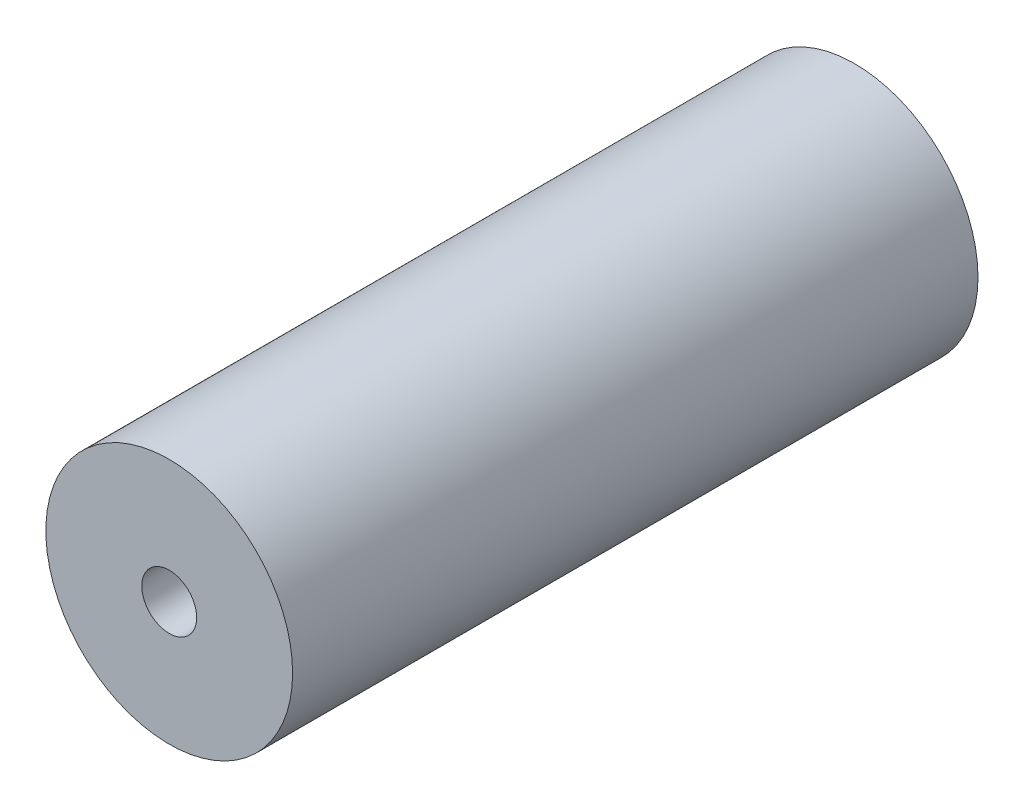
ISO-10303-21;
HEADER;
FILE_DESCRIPTION(('STEP AP214'),'2;1');
FILE_NAME('part.step','',(''),(''),'','','');
FILE_SCHEMA(('AUTOMOTIVE_DESIGN { 1 0 10303 214 1 1 1 1 }'));
ENDSEC;
DATA;
#1=APPLICATION_CONTEXT('core data for automotive mechanical design processes');
#2=APPLICATION_PROTOCOL_DEFINITION('international standard','automotive_design',2000,#1);
#3=PRODUCT_CONTEXT('',#1,'mechanical');
#4=PRODUCT('Part','Part','',(#3));
#5=PRODUCT_RELATED_PRODUCT_CATEGORY('part','',(#4));
#6=PRODUCT_DEFINITION_FORMATION('','',#4);
#7=PRODUCT_DEFINITION_CONTEXT('part definition',#1,'design');
#8=PRODUCT_DEFINITION('design','',#6,#7);
#9=PRODUCT_DEFINITION_SHAPE('','',#8);
#10=(LENGTH_UNIT() NAMED_UNIT(*) SI_UNIT(.MILLI.,.METRE.));
#11=(NAMED_UNIT(*) PLANE_ANGLE_UNIT() SI_UNIT($,.RADIAN.));
#12=(NAMED_UNIT(*) SI_UNIT($,.STERADIAN.) SOLID_ANGLE_UNIT());
#13=UNCERTAINTY_MEASURE_WITH_UNIT(LENGTH_MEASURE(1.E-05),#10,'distance_accuracy_value','');
#14=(GEOMETRIC_REPRESENTATION_CONTEXT(3) GLOBAL_UNCERTAINTY_ASSIGNED_CONTEXT((#13)) GLOBAL_UNIT_ASSIGNED_CONTEXT((#10,
#11,#12)) REPRESENTATION_CONTEXT('',''));
#15=CARTESIAN_POINT('',(0.,0.,0.));
#16=DIRECTION('',(0.,0.,1.));
#17=DIRECTION('',(1.,0.,0.));
#18=AXIS2_PLACEMENT_3D('',#15,#16,#17);
#19=CARTESIAN_POINT('',(0.,0.,-50.));
#20=DIRECTION('',(0.,0.,1.));
#21=DIRECTION('',(1.,0.,0.));
#22=AXIS2_PLACEMENT_3D('',#19,#20,#21);
#23=CYLINDRICAL_SURFACE('',#22,18.);
#24=CARTESIAN_POINT('',(0.,0.,-50.));
#25=DIRECTION('',(0.,0.,1.));
#26=DIRECTION('',(1.,0.,0.));
#27=AXIS2_PLACEMENT_3D('',#24,#25,#26);
#28=CIRCLE('',#27,18.);
#29=CARTESIAN_POINT('',(18.,0.,-50.));
#30=VERTEX_POINT('',#29);
#31=EDGE_CURVE('E10',#30,#30,#28,.T.);
#32=ORIENTED_EDGE('',*,*,#31,.T.);
#33=EDGE_LOOP('',(#32));
#34=FACE_BOUND('',#33,.T.);
#35=CARTESIAN_POINT('',(0.,0.,50.));
#36=DIRECTION('',(0.,0.,1.));
#37=DIRECTION('',(1.,0.,0.));
#38=AXIS2_PLACEMENT_3D('',#35,#36,#37);
#39=CIRCLE('',#38,18.);
#40=CARTESIAN_POINT('',(18.,0.,50.));
#41=VERTEX_POINT('',#40);
#42=EDGE_CURVE('E36',#41,#41,#39,.T.);
#43=ORIENTED_EDGE('',*,*,#42,.F.);
#44=EDGE_LOOP('',(#43));
#45=FACE_BOUND('',#44,.T.);
#46=ADVANCED_FACE('F30',(#34,#45),#23,.T.);
#47=CARTESIAN_POINT('',(0.,0.,-50.));
#48=DIRECTION('',(0.,0.,1.));
#49=DIRECTION('',(1.,0.,0.));
#50=AXIS2_PLACEMENT_3D('',#47,#48,#49);
#51=PLANE('',#50);
#52=CARTESIAN_POINT('',(0.,14.,-50.));
#53=DIRECTION('',(0.,0.,-1.));
#54=DIRECTION('',(-1.,0.,0.));
#55=AXIS2_PLACEMENT_3D('',#52,#53,#54);
#56=CIRCLE('',#55,1.5);
#57=CARTESIAN_POINT('',(-1.5,14.,-50.));
#58=VERTEX_POINT('',#57);
#59=EDGE_CURVE('E68',#58,#58,#56,.T.);
#60=ORIENTED_EDGE('',*,*,#59,.F.);
#61=EDGE_LOOP('',(#60));
#62=FACE_BOUND('',#61,.T.);
#63=CARTESIAN_POINT('',(-14.,0.,-50.));
#64=DIRECTION('',(0.,0.,-1.));
#65=DIRECTION('',(-1.,0.,0.));
#66=AXIS2_PLACEMENT_3D('',#63,#64,#65);
#67=CIRCLE('',#66,1.5);
#68=CARTESIAN_POINT('',(-15.5,0.,-50.));
#69=VERTEX_POINT('',#68);
#70=EDGE_CURVE('E62',#69,#69,#67,.T.);
#71=ORIENTED_EDGE('',*,*,#70,.F.);
#72=EDGE_LOOP('',(#71));
#73=FACE_BOUND('',#72,.T.);
#74=CARTESIAN_POINT('',(0.,-14.,-50.));
#75=DIRECTION('',(0.,0.,-1.));
#76=DIRECTION('',(-1.,0.,0.));
#77=AXIS2_PLACEMENT_3D('',#74,#75,#76);
#78=CIRCLE('',#77,1.5);
#79=CARTESIAN_POINT('',(-1.5,-14.,-50.));
#80=VERTEX_POINT('',#79);
#81=EDGE_CURVE('E56',#80,#80,#78,.T.);
#82=ORIENTED_EDGE('',*,*,#81,.F.);
#83=EDGE_LOOP('',(#82));
#84=FACE_BOUND('',#83,.T.);
#85=CARTESIAN_POINT('',(14.,0.,-50.));
#86=DIRECTION('',(0.,0.,-1.));
#87=DIRECTION('',(-1.,0.,0.));
#88=AXIS2_PLACEMENT_3D('',#85,#86,#87);
#89=CIRCLE('',#88,1.5);
#90=CARTESIAN_POINT('',(12.5,0.,-50.));
#91=VERTEX_POINT('',#90);
#92=EDGE_CURVE('E50',#91,#91,#89,.T.);
#93=ORIENTED_EDGE('',*,*,#92,.F.);
#94=EDGE_LOOP('',(#93));
#95=FACE_BOUND('',#94,.T.);
#96=CARTESIAN_POINT('',(0.,0.,-50.));
#97=DIRECTION('',(0.,0.,1.));
#98=DIRECTION('',(1.,0.,0.));
#99=AXIS2_PLACEMENT_3D('',#96,#97,#98);
#100=CIRCLE('',#99,4.);
#101=CARTESIAN_POINT('',(4.,0.,-50.));
#102=VERTEX_POINT('',#101);
#103=EDGE_CURVE('E40',#102,#102,#100,.T.);
#104=ORIENTED_EDGE('',*,*,#103,.T.);
#105=EDGE_LOOP('',(#104));
#106=FACE_BOUND('',#105,.T.);
#107=ORIENTED_EDGE('',*,*,#31,.F.);
#108=EDGE_LOOP('',(#107));
#109=FACE_BOUND('',#108,.T.);
#110=ADVANCED_FACE('F83',(#62,#73,#84,#95,#106,#109),#51,.F.);
#111=CARTESIAN_POINT('',(0.,0.,50.));
#112=DIRECTION('',(0.,0.,1.));
#113=DIRECTION('',(1.,0.,0.));
#114=AXIS2_PLACEMENT_3D('',#111,#112,#113);
#115=PLANE('',#114);
#116=CARTESIAN_POINT('',(0.,0.,50.));
#117=DIRECTION('',(0.,0.,1.));
#118=DIRECTION('',(1.,0.,0.));
#119=AXIS2_PLACEMENT_3D('',#116,#117,#118);
#120=CIRCLE('',#119,4.);
#121=CARTESIAN_POINT('',(4.,0.,50.));
#122=VERTEX_POINT('',#121);
#123=EDGE_CURVE('E44',#122,#122,#120,.T.);
#124=ORIENTED_EDGE('',*,*,#123,.F.);
#125=EDGE_LOOP('',(#124));
#126=FACE_BOUND('',#125,.T.);
#127=ORIENTED_EDGE('',*,*,#42,.T.);
#128=EDGE_LOOP('',(#127));
#129=FACE_BOUND('',#128,.T.);
#130=ADVANCED_FACE('F86',(#126,#129),#115,.T.);
#131=CARTESIAN_POINT('',(0.,0.,-72.));
#132=DIRECTION('',(0.,0.,1.));
#133=DIRECTION('',(1.,0.,0.));
#134=AXIS2_PLACEMENT_3D('',#131,#132,#133);
#135=CYLINDRICAL_SURFACE('',#134,4.);
#136=CARTESIAN_POINT('',(4.,0.,50.));
#137=CARTESIAN_POINT('',(4.,0.,48.9583333333333));
#138=CARTESIAN_POINT('',(4.,0.,47.9166666666667));
#139=CARTESIAN_POINT('',(4.,0.,45.8333333333333));
#140=CARTESIAN_POINT('',(4.,0.,44.7916666666667));
#141=CARTESIAN_POINT('',(4.,0.,42.7083333333333));
#142=CARTESIAN_POINT('',(4.,0.,41.6666666666667));
#143=CARTESIAN_POINT('',(4.,0.,39.5833333333333));
#144=CARTESIAN_POINT('',(4.,0.,38.5416666666667));
#145=CARTESIAN_POINT('',(4.,0.,36.4583333333333));
#146=CARTESIAN_POINT('',(4.,0.,35.4166666666667));
#147=CARTESIAN_POINT('',(4.,0.,33.3333333333333));
#148=CARTESIAN_POINT('',(4.,0.,32.2916666666667));
#149=CARTESIAN_POINT('',(4.,0.,30.2083333333333));
#150=CARTESIAN_POINT('',(4.,0.,29.1666666666667));
#151=CARTESIAN_POINT('',(4.,0.,27.0833333333333));
#152=CARTESIAN_POINT('',(4.,0.,26.0416666666667));
#153=CARTESIAN_POINT('',(4.,0.,23.9583333333333));
#154=CARTESIAN_POINT('',(4.,0.,22.9166666666667));
#155=CARTESIAN_POINT('',(4.,0.,20.8333333333333));
#156=CARTESIAN_POINT('',(4.,0.,19.7916666666667));
#157=CARTESIAN_POINT('',(4.,0.,17.7083333333333));
#158=CARTESIAN_POINT('',(4.,0.,16.6666666666667));
#159=CARTESIAN_POINT('',(4.,0.,14.5833333333333));
#160=CARTESIAN_POINT('',(4.,0.,13.5416666666667));
#161=CARTESIAN_POINT('',(4.,0.,11.4583333333333));
#162=CARTESIAN_POINT('',(4.,0.,10.4166666666667));
#163=CARTESIAN_POINT('',(4.,0.,8.33333333333332));
#164=CARTESIAN_POINT('',(4.,0.,7.29166666666665));
#165=CARTESIAN_POINT('',(4.,0.,5.20833333333331));
#166=CARTESIAN_POINT('',(4.,0.,4.16666666666665));
#167=CARTESIAN_POINT('',(4.,0.,2.08333333333332));
#168=CARTESIAN_POINT('',(4.,0.,1.04166666666665));
#169=CARTESIAN_POINT('',(4.,0.,-1.04166666666668));
#170=CARTESIAN_POINT('',(4.,0.,-2.08333333333335));
#171=CARTESIAN_POINT('',(4.,0.,-4.16666666666668));
#172=CARTESIAN_POINT('',(4.,0.,-5.20833333333334));
#173=CARTESIAN_POINT('',(4.,0.,-7.29166666666668));
#174=CARTESIAN_POINT('',(4.,0.,-8.33333333333335));
#175=CARTESIAN_POINT('',(4.,0.,-10.4166666666667));
#176=CARTESIAN_POINT('',(4.,0.,-11.4583333333333));
#177=CARTESIAN_POINT('',(4.,0.,-13.5416666666667));
#178=CARTESIAN_POINT('',(4.,0.,-14.5833333333333));
#179=CARTESIAN_POINT('',(4.,0.,-16.6666666666667));
#180=CARTESIAN_POINT('',(4.,0.,-17.7083333333333));
#181=CARTESIAN_POINT('',(4.,0.,-19.7916666666667));
#182=CARTESIAN_POINT('',(4.,0.,-20.8333333333333));
#183=CARTESIAN_POINT('',(4.,0.,-22.9166666666667));
#184=CARTESIAN_POINT('',(4.,0.,-23.9583333333333));
#185=CARTESIAN_POINT('',(4.,0.,-26.0416666666667));
#186=CARTESIAN_POINT('',(4.,0.,-27.0833333333333));
#187=CARTESIAN_POINT('',(4.,0.,-29.1666666666667));
#188=CARTESIAN_POINT('',(4.,0.,-30.2083333333333));
#189=CARTESIAN_POINT('',(4.,0.,-32.2916666666667));
#190=CARTESIAN_POINT('',(4.,0.,-33.3333333333333));
#191=CARTESIAN_POINT('',(4.,0.,-35.4166666666667));
#192=CARTESIAN_POINT('',(4.,0.,-36.4583333333333));
#193=CARTESIAN_POINT('',(4.,0.,-38.5416666666667));
#194=CARTESIAN_POINT('',(4.,0.,-39.5833333333333));
#195=CARTESIAN_POINT('',(4.,0.,-41.6666666666667));
#196=CARTESIAN_POINT('',(4.,0.,-42.7083333333333));
#197=CARTESIAN_POINT('',(4.,0.,-44.7916666666667));
#198=CARTESIAN_POINT('',(4.,0.,-45.8333333333333));
#199=CARTESIAN_POINT('',(4.,0.,-47.9166666666667));
#200=CARTESIAN_POINT('',(4.,0.,-48.9583333333333));
#201=CARTESIAN_POINT('',(4.,0.,-50.));
#202=B_SPLINE_CURVE_WITH_KNOTS('',3,(#136,#137,#138,#139,#140,#141,#142,#143,#144,#145,#146,
#147,#148,#149,#150,#151,#152,#153,#154,#155,#156,#157,#158,#159,#160,#161,#162,#163,#164,#165,
#166,#167,#168,#169,#170,#171,#172,#173,#174,#175,#176,#177,#178,#179,#180,#181,#182,#183,#184,
#185,#186,#187,#188,#189,#190,#191,#192,#193,#194,#195,#196,#197,#198,#199,#200,#201),
.UNSPECIFIED.,.F.,.F.,(4,2,2,2,2,2,2,2,2,2,2,2,2,2,2,2,2,2,2,2,2,2,2,2,2,2,2,2,2,2,2,2,4),(0.,
3.125,6.25000000000001,9.37499999999999,12.5,15.625,18.75,21.875,25.,28.125,31.25,34.375,37.5,
40.625,43.75,46.875,50.,53.125,56.25,59.375,62.5,65.625,68.75,71.875,75.,78.125,81.25,84.375,
87.5,90.625,93.75,96.875,100.),.UNSPECIFIED.);
#203=EDGE_CURVE('BSEAM96',#122,#102,#202,.T.);
#204=ORIENTED_EDGE('',*,*,#123,.T.);
#205=ORIENTED_EDGE('',*,*,#103,.F.);
#206=ORIENTED_EDGE('',*,*,#203,.T.);
#207=ORIENTED_EDGE('',*,*,#203,.F.);
#208=EDGE_LOOP('',(#204,#206,#205,#207));
#209=FACE_BOUND('',#208,.T.);
#210=ADVANCED_FACE('F96',(#209),#135,.F.);
#211=CARTESIAN_POINT('',(14.,0.,-45.));
#212=DIRECTION('',(0.,0.,-1.));
#213=DIRECTION('',(-1.,0.,0.));
#214=AXIS2_PLACEMENT_3D('',#211,#212,#213);
#215=CYLINDRICAL_SURFACE('',#214,1.5);
#216=CARTESIAN_POINT('',(14.,0.,-45.));
#217=DIRECTION('',(0.,0.,-1.));
#218=DIRECTION('',(-1.,0.,0.));
#219=AXIS2_PLACEMENT_3D('',#216,#217,#218);
#220=CIRCLE('',#219,1.5);
#221=CARTESIAN_POINT('',(12.5,0.,-45.));
#222=VERTEX_POINT('',#221);
#223=EDGE_CURVE('E53',#222,#222,#220,.T.);
#224=ORIENTED_EDGE('',*,*,#223,.F.);
#225=EDGE_LOOP('',(#224));
#226=FACE_BOUND('',#225,.T.);
#227=ORIENTED_EDGE('',*,*,#92,.T.);
#228=EDGE_LOOP('',(#227));
#229=FACE_BOUND('',#228,.T.);
#230=ADVANCED_FACE('F98',(#226,#229),#215,.F.);
#231=CARTESIAN_POINT('',(14.,0.,-45.));
#232=DIRECTION('',(0.,0.,-1.));
#233=DIRECTION('',(-1.,0.,0.));
#234=AXIS2_PLACEMENT_3D('',#231,#232,#233);
#235=PLANE('',#234);
#236=ORIENTED_EDGE('',*,*,#223,.T.);
#237=EDGE_LOOP('',(#236));
#238=FACE_BOUND('',#237,.T.);
#239=ADVANCED_FACE('F105',(#238),#235,.T.);
#240=CARTESIAN_POINT('',(0.,-14.,-45.));
#241=DIRECTION('',(0.,0.,-1.));
#242=DIRECTION('',(-1.,0.,0.));
#243=AXIS2_PLACEMENT_3D('',#240,#241,#242);
#244=CYLINDRICAL_SURFACE('',#243,1.5);
#245=CARTESIAN_POINT('',(0.,-14.,-45.));
#246=DIRECTION('',(0.,0.,-1.));
#247=DIRECTION('',(-1.,0.,0.));
#248=AXIS2_PLACEMENT_3D('',#245,#246,#247);
#249=CIRCLE('',#248,1.5);
#250=CARTESIAN_POINT('',(-1.5,-14.,-45.));
#251=VERTEX_POINT('',#250);
#252=EDGE_CURVE('E59',#251,#251,#249,.T.);
#253=ORIENTED_EDGE('',*,*,#252,.F.);
#254=EDGE_LOOP('',(#253));
#255=FACE_BOUND('',#254,.T.);
#256=ORIENTED_EDGE('',*,*,#81,.T.);
#257=EDGE_LOOP('',(#256));
#258=FACE_BOUND('',#257,.T.);
#259=ADVANCED_FACE('F141',(#255,#258),#244,.F.);
#260=CARTESIAN_POINT('',(0.,-14.,-45.));
#261=DIRECTION('',(0.,0.,-1.));
#262=DIRECTION('',(-1.,0.,0.));
#263=AXIS2_PLACEMENT_3D('',#260,#261,#262);
#264=PLANE('',#263);
#265=ORIENTED_EDGE('',*,*,#252,.T.);
#266=EDGE_LOOP('',(#265));
#267=FACE_BOUND('',#266,.T.);
#268=ADVANCED_FACE('F150',(#267),#264,.T.);
#269=CARTESIAN_POINT('',(-14.,0.,-45.));
#270=DIRECTION('',(0.,0.,-1.));
#271=DIRECTION('',(-1.,0.,0.));
#272=AXIS2_PLACEMENT_3D('',#269,#270,#271);
#273=CYLINDRICAL_SURFACE('',#272,1.5);
#274=CARTESIAN_POINT('',(-14.,0.,-45.));
#275=DIRECTION('',(0.,0.,-1.));
#276=DIRECTION('',(-1.,0.,0.));
#277=AXIS2_PLACEMENT_3D('',#274,#275,#276);
#278=CIRCLE('',#277,1.5);
#279=CARTESIAN_POINT('',(-15.5,0.,-45.));
#280=VERTEX_POINT('',#279);
#281=EDGE_CURVE('E65',#280,#280,#278,.T.);
#282=ORIENTED_EDGE('',*,*,#281,.F.);
#283=EDGE_LOOP('',(#282));
#284=FACE_BOUND('',#283,.T.);
#285=ORIENTED_EDGE('',*,*,#70,.T.);
#286=EDGE_LOOP('',(#285));
#287=FACE_BOUND('',#286,.T.);
#288=ADVANCED_FACE('F159',(#284,#287),#273,.F.);
#289=CARTESIAN_POINT('',(-14.,0.,-45.));
#290=DIRECTION('',(0.,0.,-1.));
#291=DIRECTION('',(-1.,0.,0.));
#292=AXIS2_PLACEMENT_3D('',#289,#290,#291);
#293=PLANE('',#292);
#294=ORIENTED_EDGE('',*,*,#281,.T.);
#295=EDGE_LOOP('',(#294));
#296=FACE_BOUND('',#295,.T.);
#297=ADVANCED_FACE('F79',(#296),#293,.T.);
#298=CARTESIAN_POINT('',(0.,14.,-45.));
#299=DIRECTION('',(0.,0.,-1.));
#300=DIRECTION('',(-1.,0.,0.));
#301=AXIS2_PLACEMENT_3D('',#298,#299,#300);
#302=CYLINDRICAL_SURFACE('',#301,1.5);
#303=CARTESIAN_POINT('',(0.,14.,-45.));
#304=DIRECTION('',(0.,0.,-1.));
#305=DIRECTION('',(-1.,0.,0.));
#306=AXIS2_PLACEMENT_3D('',#303,#304,#305);
#307=CIRCLE('',#306,1.5);
#308=CARTESIAN_POINT('',(-1.5,14.,-45.));
#309=VERTEX_POINT('',#308);
#310=EDGE_CURVE('E49',#309,#309,#307,.T.);
#311=ORIENTED_EDGE('',*,*,#310,.F.);
#312=EDGE_LOOP('',(#311));
#313=FACE_BOUND('',#312,.T.);
#314=ORIENTED_EDGE('',*,*,#59,.T.);
#315=EDGE_LOOP('',(#314));
#316=FACE_BOUND('',#315,.T.);
#317=ADVANCED_FACE('F76',(#313,#316),#302,.F.);
#318=CARTESIAN_POINT('',(0.,14.,-45.));
#319=DIRECTION('',(0.,0.,-1.));
#320=DIRECTION('',(-1.,0.,0.));
#321=AXIS2_PLACEMENT_3D('',#318,#319,#320);
#322=PLANE('',#321);
#323=ORIENTED_EDGE('',*,*,#310,.T.);
#324=EDGE_LOOP('',(#323));
#325=FACE_BOUND('',#324,.T.);
#326=ADVANCED_FACE('F74',(#325),#322,.T.);
#327=CLOSED_SHELL('',(#46,#110,#130,#210,#230,#239,#259,#268,#288,#297,#317,#326));
#328=MANIFOLD_SOLID_BREP('B2',#327);
#329=ADVANCED_BREP_SHAPE_REPRESENTATION('',(#18,#328),#14);
#330=SHAPE_DEFINITION_REPRESENTATION(#9,#329);
ENDSEC;
END-ISO-10303-21;
